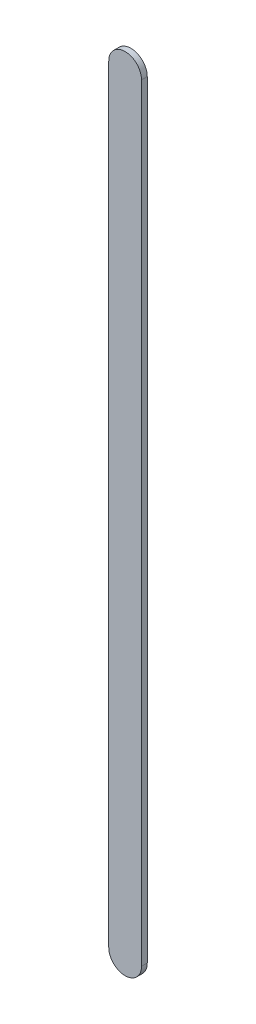
ISO-10303-21;
HEADER;
FILE_DESCRIPTION(('STEP AP214'),'2;1');
FILE_NAME('part.step','',(''),(''),'','','');
FILE_SCHEMA(('AUTOMOTIVE_DESIGN { 1 0 10303 214 1 1 1 1 }'));
ENDSEC;
DATA;
#1=APPLICATION_CONTEXT('core data for automotive mechanical design processes');
#2=APPLICATION_PROTOCOL_DEFINITION('international standard','automotive_design',2000,#1);
#3=PRODUCT_CONTEXT('',#1,'mechanical');
#4=PRODUCT('Part','Part','',(#3));
#5=PRODUCT_RELATED_PRODUCT_CATEGORY('part','',(#4));
#6=PRODUCT_DEFINITION_FORMATION('','',#4);
#7=PRODUCT_DEFINITION_CONTEXT('part definition',#1,'design');
#8=PRODUCT_DEFINITION('design','',#6,#7);
#9=PRODUCT_DEFINITION_SHAPE('','',#8);
#10=(LENGTH_UNIT() NAMED_UNIT(*) SI_UNIT(.MILLI.,.METRE.));
#11=(NAMED_UNIT(*) PLANE_ANGLE_UNIT() SI_UNIT($,.RADIAN.));
#12=(NAMED_UNIT(*) SI_UNIT($,.STERADIAN.) SOLID_ANGLE_UNIT());
#13=UNCERTAINTY_MEASURE_WITH_UNIT(LENGTH_MEASURE(1.E-05),#10,'distance_accuracy_value','');
#14=(GEOMETRIC_REPRESENTATION_CONTEXT(3) GLOBAL_UNCERTAINTY_ASSIGNED_CONTEXT((#13)) GLOBAL_UNIT_ASSIGNED_CONTEXT((#10,
#11,#12)) REPRESENTATION_CONTEXT('',''));
#15=CARTESIAN_POINT('',(0.,0.,0.));
#16=DIRECTION('',(0.,0.,1.));
#17=DIRECTION('',(1.,0.,0.));
#18=AXIS2_PLACEMENT_3D('',#15,#16,#17);
#19=CARTESIAN_POINT('',(108.298,-125.998,1.635));
#20=DIRECTION('',(0.,0.,1.));
#21=DIRECTION('',(1.,0.,0.));
#22=AXIS2_PLACEMENT_3D('',#19,#20,#21);
#23=PLANE('',#22);
#24=DIRECTION('',(0.,1.,0.));
#25=VECTOR('',#24,1.);
#26=CARTESIAN_POINT('',(108.298,-125.998,1.635));
#27=LINE('',#26,#25);
#28=CARTESIAN_POINT('',(108.298,-125.998,1.635));
#29=VERTEX_POINT('',#28);
#30=CARTESIAN_POINT('',(108.298,-121.314,1.635));
#31=VERTEX_POINT('',#30);
#32=EDGE_CURVE('E71',#29,#31,#27,.T.);
#33=ORIENTED_EDGE('',*,*,#32,.T.);
#34=CARTESIAN_POINT('',(108.198,-121.314,1.635));
#35=DIRECTION('',(0.,0.,1.));
#36=DIRECTION('',(1.,0.,0.));
#37=AXIS2_PLACEMENT_3D('',#34,#35,#36);
#38=CIRCLE('',#37,0.1);
#39=CARTESIAN_POINT('',(108.098,-121.314,1.635));
#40=VERTEX_POINT('',#39);
#41=EDGE_CURVE('E69',#31,#40,#38,.T.);
#42=ORIENTED_EDGE('',*,*,#41,.T.);
#43=DIRECTION('',(0.,-1.,0.));
#44=VECTOR('',#43,1.);
#45=CARTESIAN_POINT('',(108.098,-121.314,1.635));
#46=LINE('',#45,#44);
#47=CARTESIAN_POINT('',(108.098,-125.998,1.635));
#48=VERTEX_POINT('',#47);
#49=EDGE_CURVE('E56',#40,#48,#46,.T.);
#50=ORIENTED_EDGE('',*,*,#49,.T.);
#51=CARTESIAN_POINT('',(108.198,-125.998,1.635));
#52=DIRECTION('',(0.,0.,1.));
#53=DIRECTION('',(-1.,0.,0.));
#54=AXIS2_PLACEMENT_3D('',#51,#52,#53);
#55=CIRCLE('',#54,0.1);
#56=EDGE_CURVE('E11',#48,#29,#55,.T.);
#57=ORIENTED_EDGE('',*,*,#56,.T.);
#58=EDGE_LOOP('',(#33,#42,#50,#57));
#59=FACE_BOUND('',#58,.T.);
#60=ADVANCED_FACE('F17',(#59),#23,.T.);
#61=CARTESIAN_POINT('',(108.298,-125.998,1.6));
#62=DIRECTION('',(0.,0.,1.));
#63=DIRECTION('',(1.,0.,0.));
#64=AXIS2_PLACEMENT_3D('',#61,#62,#63);
#65=PLANE('',#64);
#66=CARTESIAN_POINT('',(108.198,-125.998,1.6));
#67=DIRECTION('',(0.,0.,1.));
#68=DIRECTION('',(-1.,0.,0.));
#69=AXIS2_PLACEMENT_3D('',#66,#67,#68);
#70=CIRCLE('',#69,0.1);
#71=CARTESIAN_POINT('',(108.098,-125.998,1.6));
#72=VERTEX_POINT('',#71);
#73=CARTESIAN_POINT('',(108.298,-125.998,1.6));
#74=VERTEX_POINT('',#73);
#75=EDGE_CURVE('E26',#72,#74,#70,.T.);
#76=ORIENTED_EDGE('',*,*,#75,.F.);
#77=DIRECTION('',(0.,-1.,0.));
#78=VECTOR('',#77,1.);
#79=CARTESIAN_POINT('',(108.098,-121.314,1.6));
#80=LINE('',#79,#78);
#81=CARTESIAN_POINT('',(108.098,-121.314,1.6));
#82=VERTEX_POINT('',#81);
#83=EDGE_CURVE('E76',#82,#72,#80,.T.);
#84=ORIENTED_EDGE('',*,*,#83,.F.);
#85=CARTESIAN_POINT('',(108.198,-121.314,1.6));
#86=DIRECTION('',(0.,0.,1.));
#87=DIRECTION('',(1.,0.,0.));
#88=AXIS2_PLACEMENT_3D('',#85,#86,#87);
#89=CIRCLE('',#88,0.1);
#90=CARTESIAN_POINT('',(108.298,-121.314,1.6));
#91=VERTEX_POINT('',#90);
#92=EDGE_CURVE('E80',#91,#82,#89,.T.);
#93=ORIENTED_EDGE('',*,*,#92,.F.);
#94=DIRECTION('',(0.,1.,0.));
#95=VECTOR('',#94,1.);
#96=CARTESIAN_POINT('',(108.298,-125.998,1.6));
#97=LINE('',#96,#95);
#98=EDGE_CURVE('E111',#74,#91,#97,.T.);
#99=ORIENTED_EDGE('',*,*,#98,.F.);
#100=EDGE_LOOP('',(#76,#84,#93,#99));
#101=FACE_BOUND('',#100,.T.);
#102=ADVANCED_FACE('F112',(#101),#65,.F.);
#103=CARTESIAN_POINT('',(108.198,-125.998,1.6));
#104=DIRECTION('',(0.,0.,-1.));
#105=DIRECTION('',(-1.,0.,0.));
#106=AXIS2_PLACEMENT_3D('',#103,#104,#105);
#107=CYLINDRICAL_SURFACE('',#106,0.1);
#108=ORIENTED_EDGE('',*,*,#75,.T.);
#109=DIRECTION('',(0.,0.,1.));
#110=VECTOR('',#109,1.);
#111=CARTESIAN_POINT('',(108.298,-125.998,1.6));
#112=LINE('',#111,#110);
#113=EDGE_CURVE('E87',#74,#29,#112,.T.);
#114=ORIENTED_EDGE('',*,*,#113,.T.);
#115=ORIENTED_EDGE('',*,*,#56,.F.);
#116=DIRECTION('',(0.,0.,1.));
#117=VECTOR('',#116,1.);
#118=CARTESIAN_POINT('',(108.098,-125.998,1.6));
#119=LINE('',#118,#117);
#120=EDGE_CURVE('E63',#72,#48,#119,.T.);
#121=ORIENTED_EDGE('',*,*,#120,.F.);
#122=EDGE_LOOP('',(#108,#114,#115,#121));
#123=FACE_BOUND('',#122,.T.);
#124=ADVANCED_FACE('F103',(#123),#107,.T.);
#125=CARTESIAN_POINT('',(108.098,-121.314,1.6));
#126=DIRECTION('',(1.,0.,0.));
#127=DIRECTION('',(0.,1.,0.));
#128=AXIS2_PLACEMENT_3D('',#125,#126,#127);
#129=PLANE('',#128);
#130=ORIENTED_EDGE('',*,*,#83,.T.);
#131=ORIENTED_EDGE('',*,*,#120,.T.);
#132=ORIENTED_EDGE('',*,*,#49,.F.);
#133=DIRECTION('',(0.,0.,1.));
#134=VECTOR('',#133,1.);
#135=CARTESIAN_POINT('',(108.098,-121.314,1.6));
#136=LINE('',#135,#134);
#137=EDGE_CURVE('E61',#82,#40,#136,.T.);
#138=ORIENTED_EDGE('',*,*,#137,.F.);
#139=EDGE_LOOP('',(#130,#131,#132,#138));
#140=FACE_BOUND('',#139,.T.);
#141=ADVANCED_FACE('F59',(#140),#129,.F.);
#142=CARTESIAN_POINT('',(108.198,-121.314,1.6));
#143=DIRECTION('',(0.,0.,-1.));
#144=DIRECTION('',(1.,0.,0.));
#145=AXIS2_PLACEMENT_3D('',#142,#143,#144);
#146=CYLINDRICAL_SURFACE('',#145,0.1);
#147=ORIENTED_EDGE('',*,*,#92,.T.);
#148=ORIENTED_EDGE('',*,*,#137,.T.);
#149=ORIENTED_EDGE('',*,*,#41,.F.);
#150=DIRECTION('',(0.,0.,1.));
#151=VECTOR('',#150,1.);
#152=CARTESIAN_POINT('',(108.298,-121.314,1.6));
#153=LINE('',#152,#151);
#154=EDGE_CURVE('E114',#91,#31,#153,.T.);
#155=ORIENTED_EDGE('',*,*,#154,.F.);
#156=EDGE_LOOP('',(#147,#148,#149,#155));
#157=FACE_BOUND('',#156,.T.);
#158=ADVANCED_FACE('F78',(#157),#146,.T.);
#159=CARTESIAN_POINT('',(108.298,-125.998,1.6));
#160=DIRECTION('',(-1.,0.,0.));
#161=DIRECTION('',(0.,0.,1.));
#162=AXIS2_PLACEMENT_3D('',#159,#160,#161);
#163=PLANE('',#162);
#164=ORIENTED_EDGE('',*,*,#98,.T.);
#165=ORIENTED_EDGE('',*,*,#154,.T.);
#166=ORIENTED_EDGE('',*,*,#32,.F.);
#167=ORIENTED_EDGE('',*,*,#113,.F.);
#168=EDGE_LOOP('',(#164,#165,#166,#167));
#169=FACE_BOUND('',#168,.T.);
#170=ADVANCED_FACE('F110',(#169),#163,.F.);
#171=CLOSED_SHELL('',(#60,#102,#124,#141,#158,#170));
#172=MANIFOLD_SOLID_BREP('B1',#171);
#173=ADVANCED_BREP_SHAPE_REPRESENTATION('',(#18,#172),#14);
#174=SHAPE_DEFINITION_REPRESENTATION(#9,#173);
ENDSEC;
END-ISO-10303-21;
